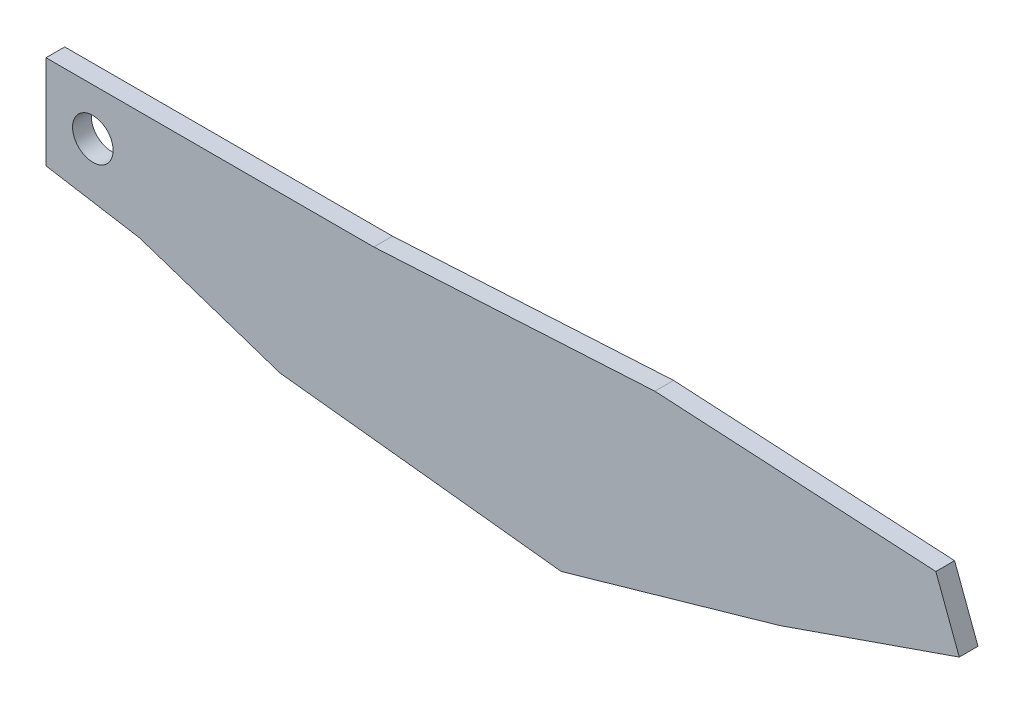
ISO-10303-21;
HEADER;
FILE_DESCRIPTION(('STEP AP214'),'2;1');
FILE_NAME('part.step','',(''),(''),'','','');
FILE_SCHEMA(('AUTOMOTIVE_DESIGN { 1 0 10303 214 1 1 1 1 }'));
ENDSEC;
DATA;
#1=APPLICATION_CONTEXT('core data for automotive mechanical design processes');
#2=APPLICATION_PROTOCOL_DEFINITION('international standard','automotive_design',2000,#1);
#3=PRODUCT_CONTEXT('',#1,'mechanical');
#4=PRODUCT('Part','Part','',(#3));
#5=PRODUCT_RELATED_PRODUCT_CATEGORY('part','',(#4));
#6=PRODUCT_DEFINITION_FORMATION('','',#4);
#7=PRODUCT_DEFINITION_CONTEXT('part definition',#1,'design');
#8=PRODUCT_DEFINITION('design','',#6,#7);
#9=PRODUCT_DEFINITION_SHAPE('','',#8);
#10=(LENGTH_UNIT() NAMED_UNIT(*) SI_UNIT(.MILLI.,.METRE.));
#11=(NAMED_UNIT(*) PLANE_ANGLE_UNIT() SI_UNIT($,.RADIAN.));
#12=(NAMED_UNIT(*) SI_UNIT($,.STERADIAN.) SOLID_ANGLE_UNIT());
#13=UNCERTAINTY_MEASURE_WITH_UNIT(LENGTH_MEASURE(1.E-05),#10,'distance_accuracy_value','');
#14=(GEOMETRIC_REPRESENTATION_CONTEXT(3) GLOBAL_UNCERTAINTY_ASSIGNED_CONTEXT((#13)) GLOBAL_UNIT_ASSIGNED_CONTEXT((#10,
#11,#12)) REPRESENTATION_CONTEXT('',''));
#15=CARTESIAN_POINT('',(0.,0.,0.));
#16=DIRECTION('',(0.,0.,1.));
#17=DIRECTION('',(1.,0.,0.));
#18=AXIS2_PLACEMENT_3D('',#15,#16,#17);
#19=CARTESIAN_POINT('',(0.,0.,1.2));
#20=DIRECTION('',(0.,0.,-1.));
#21=DIRECTION('',(-1.,0.,0.));
#22=AXIS2_PLACEMENT_3D('',#19,#20,#21);
#23=PLANE('',#22);
#24=DIRECTION('',(0.,-1.,0.));
#25=VECTOR('',#24,1.);
#26=CARTESIAN_POINT('',(-3.,3.,1.2));
#27=LINE('',#26,#25);
#28=CARTESIAN_POINT('',(-3.,3.,1.2));
#29=VERTEX_POINT('',#28);
#30=CARTESIAN_POINT('',(-3.,-3.,1.2));
#31=VERTEX_POINT('',#30);
#32=EDGE_CURVE('E171',#29,#31,#27,.T.);
#33=ORIENTED_EDGE('',*,*,#32,.T.);
#34=DIRECTION('',(0.986393923832144,-0.164398987305357,0.));
#35=VECTOR('',#34,1.);
#36=CARTESIAN_POINT('',(-3.,-3.,1.2));
#37=LINE('',#36,#35);
#38=CARTESIAN_POINT('',(3.,-4.,1.2));
#39=VERTEX_POINT('',#38);
#40=EDGE_CURVE('E105',#31,#39,#37,.T.);
#41=ORIENTED_EDGE('',*,*,#40,.T.);
#42=DIRECTION('',(0.948683298050514,-0.316227766016838,0.));
#43=VECTOR('',#42,1.);
#44=CARTESIAN_POINT('',(3.,-4.,1.2));
#45=LINE('',#44,#43);
#46=CARTESIAN_POINT('',(12.,-7.,1.2));
#47=VERTEX_POINT('',#46);
#48=EDGE_CURVE('E192',#39,#47,#45,.T.);
#49=ORIENTED_EDGE('',*,*,#48,.T.);
#50=DIRECTION('',(0.993883734673619,-0.110431526074847,0.));
#51=VECTOR('',#50,1.);
#52=CARTESIAN_POINT('',(12.,-7.,1.2));
#53=LINE('',#52,#51);
#54=CARTESIAN_POINT('',(30.,-9.,1.2));
#55=VERTEX_POINT('',#54);
#56=EDGE_CURVE('E209',#47,#55,#53,.T.);
#57=ORIENTED_EDGE('',*,*,#56,.T.);
#58=DIRECTION('',(0.961523947640823,0.274721127897378,0.));
#59=VECTOR('',#58,1.);
#60=CARTESIAN_POINT('',(30.,-9.,1.2));
#61=LINE('',#60,#59);
#62=CARTESIAN_POINT('',(44.,-5.,1.2));
#63=VERTEX_POINT('',#62);
#64=EDGE_CURVE('E206',#55,#63,#61,.T.);
#65=ORIENTED_EDGE('',*,*,#64,.T.);
#66=DIRECTION('',(0.944496796706159,0.328520624941273,0.));
#67=VECTOR('',#66,1.);
#68=CARTESIAN_POINT('',(44.,-5.,1.2));
#69=LINE('',#68,#67);
#70=CARTESIAN_POINT('',(55.5,-1.,1.2));
#71=VERTEX_POINT('',#70);
#72=EDGE_CURVE('E208',#63,#71,#69,.T.);
#73=ORIENTED_EDGE('',*,*,#72,.T.);
#74=DIRECTION('',(-0.351123441588392,0.936329177569045,0.));
#75=VECTOR('',#74,1.);
#76=CARTESIAN_POINT('',(55.5,-1.,1.2));
#77=LINE('',#76,#75);
#78=CARTESIAN_POINT('',(54.,3.,1.2));
#79=VERTEX_POINT('',#78);
#80=EDGE_CURVE('E131',#71,#79,#77,.T.);
#81=ORIENTED_EDGE('',*,*,#80,.T.);
#82=DIRECTION('',(-0.998460353205412,0.0554700196225229,0.));
#83=VECTOR('',#82,1.);
#84=CARTESIAN_POINT('',(54.,3.,1.2));
#85=LINE('',#84,#83);
#86=CARTESIAN_POINT('',(36.,4.,1.2));
#87=VERTEX_POINT('',#86);
#88=EDGE_CURVE('E124',#79,#87,#85,.T.);
#89=ORIENTED_EDGE('',*,*,#88,.T.);
#90=DIRECTION('',(-0.998460353205412,-0.0554700196225229,0.));
#91=VECTOR('',#90,1.);
#92=CARTESIAN_POINT('',(36.,4.,1.2));
#93=LINE('',#92,#91);
#94=CARTESIAN_POINT('',(18.,3.,1.2));
#95=VERTEX_POINT('',#94);
#96=EDGE_CURVE('E128',#87,#95,#93,.T.);
#97=ORIENTED_EDGE('',*,*,#96,.T.);
#98=DIRECTION('',(-1.,0.,0.));
#99=VECTOR('',#98,1.);
#100=CARTESIAN_POINT('',(18.,3.,1.2));
#101=LINE('',#100,#99);
#102=EDGE_CURVE('E58',#95,#29,#101,.T.);
#103=ORIENTED_EDGE('',*,*,#102,.T.);
#104=EDGE_LOOP('',(#33,#41,#49,#57,#65,#73,#81,#89,#97,#103));
#105=FACE_BOUND('',#104,.T.);
#106=CARTESIAN_POINT('',(0.,0.,1.2));
#107=DIRECTION('',(0.,0.,1.));
#108=DIRECTION('',(1.,0.,0.));
#109=AXIS2_PLACEMENT_3D('',#106,#107,#108);
#110=CIRCLE('',#109,1.3);
#111=CARTESIAN_POINT('',(1.3,0.,1.2));
#112=VERTEX_POINT('',#111);
#113=EDGE_CURVE('E155',#112,#112,#110,.T.);
#114=ORIENTED_EDGE('',*,*,#113,.F.);
#115=EDGE_LOOP('',(#114));
#116=FACE_BOUND('',#115,.T.);
#117=ADVANCED_FACE('F41',(#105,#116),#23,.F.);
#118=CARTESIAN_POINT('',(0.,0.,0.));
#119=DIRECTION('',(0.,0.,-1.));
#120=DIRECTION('',(-1.,0.,0.));
#121=AXIS2_PLACEMENT_3D('',#118,#119,#120);
#122=PLANE('',#121);
#123=DIRECTION('',(0.,-1.,0.));
#124=VECTOR('',#123,1.);
#125=CARTESIAN_POINT('',(-3.,3.,0.));
#126=LINE('',#125,#124);
#127=CARTESIAN_POINT('',(-3.,3.,0.));
#128=VERTEX_POINT('',#127);
#129=CARTESIAN_POINT('',(-3.,-3.,0.));
#130=VERTEX_POINT('',#129);
#131=EDGE_CURVE('E151',#128,#130,#126,.T.);
#132=ORIENTED_EDGE('',*,*,#131,.F.);
#133=DIRECTION('',(-1.,0.,0.));
#134=VECTOR('',#133,1.);
#135=CARTESIAN_POINT('',(4.,3.,0.));
#136=LINE('',#135,#134);
#137=CARTESIAN_POINT('',(18.,3.,0.));
#138=VERTEX_POINT('',#137);
#139=EDGE_CURVE('E93',#138,#128,#136,.T.);
#140=ORIENTED_EDGE('',*,*,#139,.F.);
#141=DIRECTION('',(-0.998460353205412,-0.0554700196225229,0.));
#142=VECTOR('',#141,1.);
#143=CARTESIAN_POINT('',(36.,4.,0.));
#144=LINE('',#143,#142);
#145=CARTESIAN_POINT('',(36.,4.,0.));
#146=VERTEX_POINT('',#145);
#147=EDGE_CURVE('E168',#146,#138,#144,.T.);
#148=ORIENTED_EDGE('',*,*,#147,.F.);
#149=DIRECTION('',(-0.998460353205412,0.0554700196225229,0.));
#150=VECTOR('',#149,1.);
#151=CARTESIAN_POINT('',(54.,3.,0.));
#152=LINE('',#151,#150);
#153=CARTESIAN_POINT('',(54.,3.,0.));
#154=VERTEX_POINT('',#153);
#155=EDGE_CURVE('E140',#154,#146,#152,.T.);
#156=ORIENTED_EDGE('',*,*,#155,.F.);
#157=DIRECTION('',(-0.351123441588392,0.936329177569045,0.));
#158=VECTOR('',#157,1.);
#159=CARTESIAN_POINT('',(55.5,-1.,0.));
#160=LINE('',#159,#158);
#161=CARTESIAN_POINT('',(55.5,-1.,0.));
#162=VERTEX_POINT('',#161);
#163=EDGE_CURVE('E165',#162,#154,#160,.T.);
#164=ORIENTED_EDGE('',*,*,#163,.F.);
#165=DIRECTION('',(0.944496796706159,0.328520624941273,0.));
#166=VECTOR('',#165,1.);
#167=CARTESIAN_POINT('',(44.,-5.,0.));
#168=LINE('',#167,#166);
#169=CARTESIAN_POINT('',(44.,-5.,0.));
#170=VERTEX_POINT('',#169);
#171=EDGE_CURVE('E163',#170,#162,#168,.T.);
#172=ORIENTED_EDGE('',*,*,#171,.F.);
#173=DIRECTION('',(0.961523947640823,0.274721127897378,0.));
#174=VECTOR('',#173,1.);
#175=CARTESIAN_POINT('',(30.,-9.,0.));
#176=LINE('',#175,#174);
#177=CARTESIAN_POINT('',(30.,-9.,0.));
#178=VERTEX_POINT('',#177);
#179=EDGE_CURVE('E161',#178,#170,#176,.T.);
#180=ORIENTED_EDGE('',*,*,#179,.F.);
#181=DIRECTION('',(0.993883734673619,-0.110431526074847,0.));
#182=VECTOR('',#181,1.);
#183=CARTESIAN_POINT('',(12.,-7.,0.));
#184=LINE('',#183,#182);
#185=CARTESIAN_POINT('',(12.,-7.,0.));
#186=VERTEX_POINT('',#185);
#187=EDGE_CURVE('E159',#186,#178,#184,.T.);
#188=ORIENTED_EDGE('',*,*,#187,.F.);
#189=DIRECTION('',(0.948683298050514,-0.316227766016838,0.));
#190=VECTOR('',#189,1.);
#191=CARTESIAN_POINT('',(3.,-4.,0.));
#192=LINE('',#191,#190);
#193=CARTESIAN_POINT('',(3.,-4.,0.));
#194=VERTEX_POINT('',#193);
#195=EDGE_CURVE('E157',#194,#186,#192,.T.);
#196=ORIENTED_EDGE('',*,*,#195,.F.);
#197=DIRECTION('',(0.986393923832144,-0.164398987305357,0.));
#198=VECTOR('',#197,1.);
#199=CARTESIAN_POINT('',(-3.,-3.,0.));
#200=LINE('',#199,#198);
#201=EDGE_CURVE('E154',#130,#194,#200,.T.);
#202=ORIENTED_EDGE('',*,*,#201,.F.);
#203=EDGE_LOOP('',(#132,#140,#148,#156,#164,#172,#180,#188,#196,#202));
#204=FACE_BOUND('',#203,.T.);
#205=CARTESIAN_POINT('',(0.,0.,0.));
#206=DIRECTION('',(0.,0.,1.));
#207=DIRECTION('',(1.,0.,0.));
#208=AXIS2_PLACEMENT_3D('',#205,#206,#207);
#209=CIRCLE('',#208,1.3);
#210=CARTESIAN_POINT('',(1.3,0.,0.));
#211=VERTEX_POINT('',#210);
#212=EDGE_CURVE('E217',#211,#211,#209,.T.);
#213=ORIENTED_EDGE('',*,*,#212,.T.);
#214=EDGE_LOOP('',(#213));
#215=FACE_BOUND('',#214,.T.);
#216=ADVANCED_FACE('F194',(#204,#215),#122,.T.);
#217=CARTESIAN_POINT('',(-3.,3.,1.2));
#218=DIRECTION('',(1.,0.,0.));
#219=DIRECTION('',(0.,0.,-1.));
#220=AXIS2_PLACEMENT_3D('',#217,#218,#219);
#221=PLANE('',#220);
#222=ORIENTED_EDGE('',*,*,#131,.T.);
#223=DIRECTION('',(0.,0.,-1.));
#224=VECTOR('',#223,1.);
#225=CARTESIAN_POINT('',(-3.,-3.,1.2));
#226=LINE('',#225,#224);
#227=EDGE_CURVE('E11',#31,#130,#226,.T.);
#228=ORIENTED_EDGE('',*,*,#227,.F.);
#229=ORIENTED_EDGE('',*,*,#32,.F.);
#230=DIRECTION('',(0.,0.,-1.));
#231=VECTOR('',#230,1.);
#232=CARTESIAN_POINT('',(-3.,3.,1.2));
#233=LINE('',#232,#231);
#234=EDGE_CURVE('E147',#29,#128,#233,.T.);
#235=ORIENTED_EDGE('',*,*,#234,.T.);
#236=EDGE_LOOP('',(#222,#228,#229,#235));
#237=FACE_BOUND('',#236,.T.);
#238=ADVANCED_FACE('F43',(#237),#221,.F.);
#239=CARTESIAN_POINT('',(-3.,-3.,1.2));
#240=DIRECTION('',(0.164398987305357,0.986393923832144,0.));
#241=DIRECTION('',(-0.986393923832144,0.164398987305357,0.));
#242=AXIS2_PLACEMENT_3D('',#239,#240,#241);
#243=PLANE('',#242);
#244=ORIENTED_EDGE('',*,*,#201,.T.);
#245=DIRECTION('',(0.,0.,-1.));
#246=VECTOR('',#245,1.);
#247=CARTESIAN_POINT('',(3.,-4.,1.2));
#248=LINE('',#247,#246);
#249=EDGE_CURVE('E50',#39,#194,#248,.T.);
#250=ORIENTED_EDGE('',*,*,#249,.F.);
#251=ORIENTED_EDGE('',*,*,#40,.F.);
#252=ORIENTED_EDGE('',*,*,#227,.T.);
#253=EDGE_LOOP('',(#244,#250,#251,#252));
#254=FACE_BOUND('',#253,.T.);
#255=ADVANCED_FACE('F253',(#254),#243,.F.);
#256=CARTESIAN_POINT('',(3.,-4.,1.2));
#257=DIRECTION('',(0.316227766016838,0.948683298050514,0.));
#258=DIRECTION('',(-0.948683298050514,0.316227766016838,0.));
#259=AXIS2_PLACEMENT_3D('',#256,#257,#258);
#260=PLANE('',#259);
#261=ORIENTED_EDGE('',*,*,#195,.T.);
#262=DIRECTION('',(0.,0.,-1.));
#263=VECTOR('',#262,1.);
#264=CARTESIAN_POINT('',(12.,-7.,1.2));
#265=LINE('',#264,#263);
#266=EDGE_CURVE('E184',#47,#186,#265,.T.);
#267=ORIENTED_EDGE('',*,*,#266,.F.);
#268=ORIENTED_EDGE('',*,*,#48,.F.);
#269=ORIENTED_EDGE('',*,*,#249,.T.);
#270=EDGE_LOOP('',(#261,#267,#268,#269));
#271=FACE_BOUND('',#270,.T.);
#272=ADVANCED_FACE('F190',(#271),#260,.F.);
#273=CARTESIAN_POINT('',(12.,-7.,1.2));
#274=DIRECTION('',(0.110431526074847,0.993883734673619,0.));
#275=DIRECTION('',(-0.993883734673619,0.110431526074847,0.));
#276=AXIS2_PLACEMENT_3D('',#273,#274,#275);
#277=PLANE('',#276);
#278=ORIENTED_EDGE('',*,*,#187,.T.);
#279=DIRECTION('',(0.,0.,-1.));
#280=VECTOR('',#279,1.);
#281=CARTESIAN_POINT('',(30.,-9.,1.2));
#282=LINE('',#281,#280);
#283=EDGE_CURVE('E181',#55,#178,#282,.T.);
#284=ORIENTED_EDGE('',*,*,#283,.F.);
#285=ORIENTED_EDGE('',*,*,#56,.F.);
#286=ORIENTED_EDGE('',*,*,#266,.T.);
#287=EDGE_LOOP('',(#278,#284,#285,#286));
#288=FACE_BOUND('',#287,.T.);
#289=ADVANCED_FACE('F200',(#288),#277,.F.);
#290=CARTESIAN_POINT('',(30.,-9.,1.2));
#291=DIRECTION('',(-0.274721127897378,0.961523947640823,0.));
#292=DIRECTION('',(-0.961523947640823,-0.274721127897378,0.));
#293=AXIS2_PLACEMENT_3D('',#290,#291,#292);
#294=PLANE('',#293);
#295=ORIENTED_EDGE('',*,*,#179,.T.);
#296=DIRECTION('',(0.,0.,-1.));
#297=VECTOR('',#296,1.);
#298=CARTESIAN_POINT('',(44.,-5.,1.2));
#299=LINE('',#298,#297);
#300=EDGE_CURVE('E178',#63,#170,#299,.T.);
#301=ORIENTED_EDGE('',*,*,#300,.F.);
#302=ORIENTED_EDGE('',*,*,#64,.F.);
#303=ORIENTED_EDGE('',*,*,#283,.T.);
#304=EDGE_LOOP('',(#295,#301,#302,#303));
#305=FACE_BOUND('',#304,.T.);
#306=ADVANCED_FACE('F204',(#305),#294,.F.);
#307=CARTESIAN_POINT('',(44.,-5.,1.2));
#308=DIRECTION('',(-0.328520624941273,0.944496796706159,0.));
#309=DIRECTION('',(-0.944496796706159,-0.328520624941273,0.));
#310=AXIS2_PLACEMENT_3D('',#307,#308,#309);
#311=PLANE('',#310);
#312=ORIENTED_EDGE('',*,*,#171,.T.);
#313=DIRECTION('',(0.,0.,-1.));
#314=VECTOR('',#313,1.);
#315=CARTESIAN_POINT('',(55.5,-1.,1.2));
#316=LINE('',#315,#314);
#317=EDGE_CURVE('E175',#71,#162,#316,.T.);
#318=ORIENTED_EDGE('',*,*,#317,.F.);
#319=ORIENTED_EDGE('',*,*,#72,.F.);
#320=ORIENTED_EDGE('',*,*,#300,.T.);
#321=EDGE_LOOP('',(#312,#318,#319,#320));
#322=FACE_BOUND('',#321,.T.);
#323=ADVANCED_FACE('F243',(#322),#311,.F.);
#324=CARTESIAN_POINT('',(55.5,-1.,1.2));
#325=DIRECTION('',(-0.936329177569044,-0.351123441588392,0.));
#326=DIRECTION('',(0.351123441588392,-0.936329177569044,0.));
#327=AXIS2_PLACEMENT_3D('',#324,#325,#326);
#328=PLANE('',#327);
#329=ORIENTED_EDGE('',*,*,#163,.T.);
#330=DIRECTION('',(0.,0.,-1.));
#331=VECTOR('',#330,1.);
#332=CARTESIAN_POINT('',(54.,3.,1.2));
#333=LINE('',#332,#331);
#334=EDGE_CURVE('E142',#79,#154,#333,.T.);
#335=ORIENTED_EDGE('',*,*,#334,.F.);
#336=ORIENTED_EDGE('',*,*,#80,.F.);
#337=ORIENTED_EDGE('',*,*,#317,.T.);
#338=EDGE_LOOP('',(#329,#335,#336,#337));
#339=FACE_BOUND('',#338,.T.);
#340=ADVANCED_FACE('F240',(#339),#328,.F.);
#341=CARTESIAN_POINT('',(54.,3.,1.2));
#342=DIRECTION('',(-0.0554700196225229,-0.998460353205412,0.));
#343=DIRECTION('',(0.998460353205412,-0.0554700196225229,0.));
#344=AXIS2_PLACEMENT_3D('',#341,#342,#343);
#345=PLANE('',#344);
#346=ORIENTED_EDGE('',*,*,#155,.T.);
#347=DIRECTION('',(0.,0.,-1.));
#348=VECTOR('',#347,1.);
#349=CARTESIAN_POINT('',(36.,4.,1.2));
#350=LINE('',#349,#348);
#351=EDGE_CURVE('E137',#87,#146,#350,.T.);
#352=ORIENTED_EDGE('',*,*,#351,.F.);
#353=ORIENTED_EDGE('',*,*,#88,.F.);
#354=ORIENTED_EDGE('',*,*,#334,.T.);
#355=EDGE_LOOP('',(#346,#352,#353,#354));
#356=FACE_BOUND('',#355,.T.);
#357=ADVANCED_FACE('F138',(#356),#345,.F.);
#358=CARTESIAN_POINT('',(36.,4.,1.2));
#359=DIRECTION('',(0.0554700196225229,-0.998460353205412,0.));
#360=DIRECTION('',(0.998460353205412,0.0554700196225229,0.));
#361=AXIS2_PLACEMENT_3D('',#358,#359,#360);
#362=PLANE('',#361);
#363=ORIENTED_EDGE('',*,*,#147,.T.);
#364=DIRECTION('',(0.,0.,-1.));
#365=VECTOR('',#364,1.);
#366=CARTESIAN_POINT('',(18.,3.,1.2));
#367=LINE('',#366,#365);
#368=EDGE_CURVE('E143',#95,#138,#367,.T.);
#369=ORIENTED_EDGE('',*,*,#368,.F.);
#370=ORIENTED_EDGE('',*,*,#96,.F.);
#371=ORIENTED_EDGE('',*,*,#351,.T.);
#372=EDGE_LOOP('',(#363,#369,#370,#371));
#373=FACE_BOUND('',#372,.T.);
#374=ADVANCED_FACE('F145',(#373),#362,.F.);
#375=CARTESIAN_POINT('',(4.,3.,1.2));
#376=DIRECTION('',(0.,-1.,0.));
#377=DIRECTION('',(0.,0.,-1.));
#378=AXIS2_PLACEMENT_3D('',#375,#376,#377);
#379=PLANE('',#378);
#380=ORIENTED_EDGE('',*,*,#139,.T.);
#381=ORIENTED_EDGE('',*,*,#234,.F.);
#382=ORIENTED_EDGE('',*,*,#102,.F.);
#383=ORIENTED_EDGE('',*,*,#368,.T.);
#384=EDGE_LOOP('',(#380,#381,#382,#383));
#385=FACE_BOUND('',#384,.T.);
#386=ADVANCED_FACE('F233',(#385),#379,.F.);
#387=CARTESIAN_POINT('',(0.,0.,1.2));
#388=DIRECTION('',(0.,0.,-1.));
#389=DIRECTION('',(-1.,0.,0.));
#390=AXIS2_PLACEMENT_3D('',#387,#388,#389);
#391=CYLINDRICAL_SURFACE('',#390,1.3);
#392=ORIENTED_EDGE('',*,*,#113,.T.);
#393=EDGE_LOOP('',(#392));
#394=FACE_BOUND('',#393,.T.);
#395=ORIENTED_EDGE('',*,*,#212,.F.);
#396=EDGE_LOOP('',(#395));
#397=FACE_BOUND('',#396,.T.);
#398=ADVANCED_FACE('F223',(#394,#397),#391,.F.);
#399=CLOSED_SHELL('',(#117,#216,#238,#255,#272,#289,#306,#323,#340,#357,#374,#386,#398));
#400=MANIFOLD_SOLID_BREP('B2',#399);
#401=ADVANCED_BREP_SHAPE_REPRESENTATION('',(#18,#400),#14);
#402=SHAPE_DEFINITION_REPRESENTATION(#9,#401);
ENDSEC;
END-ISO-10303-21;
